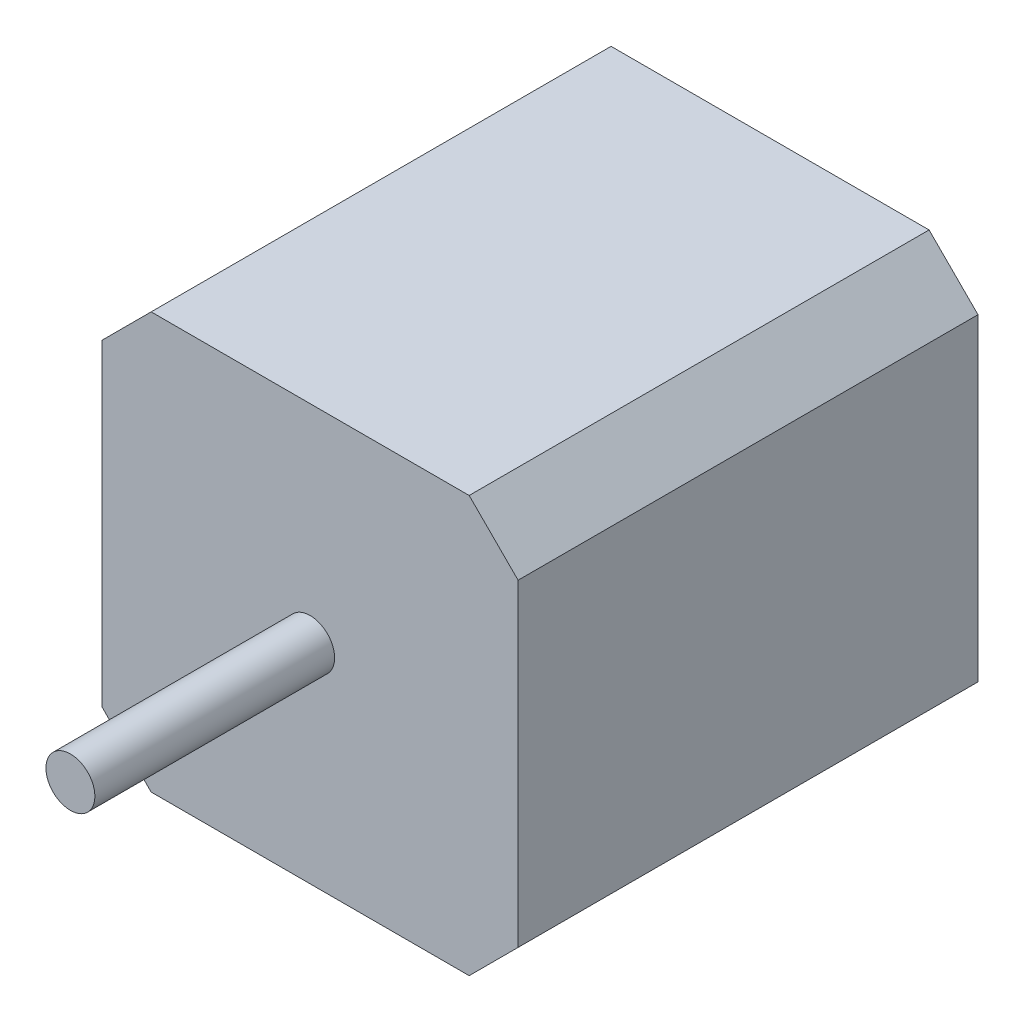
ISO-10303-21;
HEADER;
FILE_DESCRIPTION(('STEP AP214'),'2;1');
FILE_NAME('part.step','',(''),(''),'','','');
FILE_SCHEMA(('AUTOMOTIVE_DESIGN { 1 0 10303 214 1 1 1 1 }'));
ENDSEC;
DATA;
#1=APPLICATION_CONTEXT('core data for automotive mechanical design processes');
#2=APPLICATION_PROTOCOL_DEFINITION('international standard','automotive_design',2000,#1);
#3=PRODUCT_CONTEXT('',#1,'mechanical');
#4=PRODUCT('Part','Part','',(#3));
#5=PRODUCT_RELATED_PRODUCT_CATEGORY('part','',(#4));
#6=PRODUCT_DEFINITION_FORMATION('','',#4);
#7=PRODUCT_DEFINITION_CONTEXT('part definition',#1,'design');
#8=PRODUCT_DEFINITION('design','',#6,#7);
#9=PRODUCT_DEFINITION_SHAPE('','',#8);
#10=(LENGTH_UNIT() NAMED_UNIT(*) SI_UNIT(.MILLI.,.METRE.));
#11=(NAMED_UNIT(*) PLANE_ANGLE_UNIT() SI_UNIT($,.RADIAN.));
#12=(NAMED_UNIT(*) SI_UNIT($,.STERADIAN.) SOLID_ANGLE_UNIT());
#13=UNCERTAINTY_MEASURE_WITH_UNIT(LENGTH_MEASURE(1.E-05),#10,'distance_accuracy_value','');
#14=(GEOMETRIC_REPRESENTATION_CONTEXT(3) GLOBAL_UNCERTAINTY_ASSIGNED_CONTEXT((#13)) GLOBAL_UNIT_ASSIGNED_CONTEXT((#10,
#11,#12)) REPRESENTATION_CONTEXT('',''));
#15=CARTESIAN_POINT('',(0.,0.,0.));
#16=DIRECTION('',(0.,0.,1.));
#17=DIRECTION('',(1.,0.,0.));
#18=AXIS2_PLACEMENT_3D('',#15,#16,#17);
#19=CARTESIAN_POINT('',(0.,0.,47.));
#20=DIRECTION('',(0.,0.,1.));
#21=DIRECTION('',(1.,0.,0.));
#22=AXIS2_PLACEMENT_3D('',#19,#20,#21);
#23=PLANE('',#22);
#24=DIRECTION('',(1.,0.,0.));
#25=VECTOR('',#24,1.);
#26=CARTESIAN_POINT('',(-41.6448477794809,-14.902025479471,47.));
#27=LINE('',#26,#25);
#28=CARTESIAN_POINT('',(-36.6448477794809,-14.902025479471,47.));
#29=VERTEX_POINT('',#28);
#30=CARTESIAN_POINT('',(-4.14484777948092,-14.902025479471,47.));
#31=VERTEX_POINT('',#30);
#32=EDGE_CURVE('E170',#29,#31,#27,.T.);
#33=ORIENTED_EDGE('',*,*,#32,.T.);
#34=DIRECTION('',(-0.707106781186548,-0.707106781186547,0.));
#35=VECTOR('',#34,1.);
#36=CARTESIAN_POINT('',(5.37858884999505,-5.37858884999506,47.));
#37=LINE('',#36,#35);
#38=CARTESIAN_POINT('',(0.855152220519106,-9.90202547947099,47.));
#39=VERTEX_POINT('',#38);
#40=EDGE_CURVE('E148',#31,#39,#37,.F.);
#41=ORIENTED_EDGE('',*,*,#40,.T.);
#42=DIRECTION('',(0.,1.,0.));
#43=VECTOR('',#42,1.);
#44=CARTESIAN_POINT('',(0.855152220519101,27.597974520529,47.));
#45=LINE('',#44,#43);
#46=CARTESIAN_POINT('',(0.855152220519099,22.597974520529,47.));
#47=VERTEX_POINT('',#46);
#48=EDGE_CURVE('E119',#39,#47,#45,.T.);
#49=ORIENTED_EDGE('',*,*,#48,.T.);
#50=DIRECTION('',(0.707106781186547,-0.707106781186548,0.));
#51=VECTOR('',#50,1.);
#52=CARTESIAN_POINT('',(11.7265633705241,11.726563370524,47.));
#53=LINE('',#52,#51);
#54=CARTESIAN_POINT('',(-4.14484777948089,27.597974520529,47.));
#55=VERTEX_POINT('',#54);
#56=EDGE_CURVE('E55',#47,#55,#53,.F.);
#57=ORIENTED_EDGE('',*,*,#56,.T.);
#58=DIRECTION('',(-1.,0.,0.));
#59=VECTOR('',#58,1.);
#60=CARTESIAN_POINT('',(-41.6448477794809,27.597974520529,47.));
#61=LINE('',#60,#59);
#62=CARTESIAN_POINT('',(-36.6448477794809,27.597974520529,47.));
#63=VERTEX_POINT('',#62);
#64=EDGE_CURVE('E134',#55,#63,#61,.T.);
#65=ORIENTED_EDGE('',*,*,#64,.T.);
#66=DIRECTION('',(0.707106781186549,0.707106781186547,0.));
#67=VECTOR('',#66,1.);
#68=CARTESIAN_POINT('',(-32.1214111500049,32.121411150005,47.));
#69=LINE('',#68,#67);
#70=CARTESIAN_POINT('',(-41.6448477794809,22.597974520529,47.));
#71=VERTEX_POINT('',#70);
#72=EDGE_CURVE('E144',#63,#71,#69,.F.);
#73=ORIENTED_EDGE('',*,*,#72,.T.);
#74=DIRECTION('',(0.,-1.,0.));
#75=VECTOR('',#74,1.);
#76=CARTESIAN_POINT('',(-41.6448477794809,27.597974520529,47.));
#77=LINE('',#76,#75);
#78=CARTESIAN_POINT('',(-41.6448477794809,-9.90202547947095,47.));
#79=VERTEX_POINT('',#78);
#80=EDGE_CURVE('E128',#71,#79,#77,.T.);
#81=ORIENTED_EDGE('',*,*,#80,.T.);
#82=DIRECTION('',(-0.707106781186546,0.70710678118655,0.));
#83=VECTOR('',#82,1.);
#84=CARTESIAN_POINT('',(-25.773436629476,-25.7734366294759,47.));
#85=LINE('',#84,#83);
#86=EDGE_CURVE('E146',#79,#29,#85,.F.);
#87=ORIENTED_EDGE('',*,*,#86,.T.);
#88=EDGE_LOOP('',(#33,#41,#49,#57,#65,#73,#81,#87));
#89=FACE_BOUND('',#88,.T.);
#90=CARTESIAN_POINT('',(-20.3948477794809,6.347974520529,47.));
#91=DIRECTION('',(0.,0.,1.));
#92=DIRECTION('',(1.,0.,0.));
#93=AXIS2_PLACEMENT_3D('',#90,#91,#92);
#94=CIRCLE('',#93,2.5);
#95=CARTESIAN_POINT('',(-17.8948477794809,6.347974520529,47.));
#96=VERTEX_POINT('',#95);
#97=EDGE_CURVE('E175',#96,#96,#94,.T.);
#98=ORIENTED_EDGE('',*,*,#97,.F.);
#99=EDGE_LOOP('',(#98));
#100=FACE_BOUND('',#99,.T.);
#101=ADVANCED_FACE('F35',(#89,#100),#23,.T.);
#102=CARTESIAN_POINT('',(-41.6448477794809,27.597974520529,47.));
#103=DIRECTION('',(1.,0.,0.));
#104=DIRECTION('',(0.,0.,-1.));
#105=AXIS2_PLACEMENT_3D('',#102,#103,#104);
#106=PLANE('',#105);
#107=DIRECTION('',(0.,-1.,0.));
#108=VECTOR('',#107,1.);
#109=CARTESIAN_POINT('',(-41.6448477794809,27.597974520529,0.));
#110=LINE('',#109,#108);
#111=CARTESIAN_POINT('',(-41.6448477794809,22.597974520529,0.));
#112=VERTEX_POINT('',#111);
#113=CARTESIAN_POINT('',(-41.6448477794809,-9.90202547947096,0.));
#114=VERTEX_POINT('',#113);
#115=EDGE_CURVE('E130',#112,#114,#110,.T.);
#116=ORIENTED_EDGE('',*,*,#115,.T.);
#117=DIRECTION('',(0.,0.,1.));
#118=VECTOR('',#117,1.);
#119=CARTESIAN_POINT('',(-41.6448477794809,-9.90202547947096,47.));
#120=LINE('',#119,#118);
#121=EDGE_CURVE('E153',#114,#79,#120,.T.);
#122=ORIENTED_EDGE('',*,*,#121,.T.);
#123=ORIENTED_EDGE('',*,*,#80,.F.);
#124=DIRECTION('',(0.,0.,-1.));
#125=VECTOR('',#124,1.);
#126=CARTESIAN_POINT('',(-41.6448477794809,22.597974520529,47.));
#127=LINE('',#126,#125);
#128=EDGE_CURVE('E150',#71,#112,#127,.T.);
#129=ORIENTED_EDGE('',*,*,#128,.T.);
#130=EDGE_LOOP('',(#116,#122,#123,#129));
#131=FACE_BOUND('',#130,.T.);
#132=ADVANCED_FACE('F166',(#131),#106,.F.);
#133=CARTESIAN_POINT('',(-41.6448477794809,-14.902025479471,47.));
#134=DIRECTION('',(0.,1.,0.));
#135=DIRECTION('',(0.,0.,1.));
#136=AXIS2_PLACEMENT_3D('',#133,#134,#135);
#137=PLANE('',#136);
#138=DIRECTION('',(1.,0.,0.));
#139=VECTOR('',#138,1.);
#140=CARTESIAN_POINT('',(-41.6448477794809,-14.902025479471,0.));
#141=LINE('',#140,#139);
#142=CARTESIAN_POINT('',(-36.6448477794809,-14.902025479471,0.));
#143=VERTEX_POINT('',#142);
#144=CARTESIAN_POINT('',(-4.14484777948091,-14.902025479471,0.));
#145=VERTEX_POINT('',#144);
#146=EDGE_CURVE('E126',#143,#145,#141,.T.);
#147=ORIENTED_EDGE('',*,*,#146,.T.);
#148=DIRECTION('',(0.,0.,1.));
#149=VECTOR('',#148,1.);
#150=CARTESIAN_POINT('',(-4.14484777948091,-14.902025479471,47.));
#151=LINE('',#150,#149);
#152=EDGE_CURVE('E105',#145,#31,#151,.T.);
#153=ORIENTED_EDGE('',*,*,#152,.T.);
#154=ORIENTED_EDGE('',*,*,#32,.F.);
#155=DIRECTION('',(0.,0.,-1.));
#156=VECTOR('',#155,1.);
#157=CARTESIAN_POINT('',(-36.6448477794809,-14.902025479471,47.));
#158=LINE('',#157,#156);
#159=EDGE_CURVE('E110',#29,#143,#158,.T.);
#160=ORIENTED_EDGE('',*,*,#159,.T.);
#161=EDGE_LOOP('',(#147,#153,#154,#160));
#162=FACE_BOUND('',#161,.T.);
#163=ADVANCED_FACE('F193',(#162),#137,.F.);
#164=CARTESIAN_POINT('',(0.855152220519101,27.597974520529,47.));
#165=DIRECTION('',(-1.,0.,0.));
#166=DIRECTION('',(0.,-1.,0.));
#167=AXIS2_PLACEMENT_3D('',#164,#165,#166);
#168=PLANE('',#167);
#169=ORIENTED_EDGE('',*,*,#48,.F.);
#170=DIRECTION('',(0.,0.,-1.));
#171=VECTOR('',#170,1.);
#172=CARTESIAN_POINT('',(0.855152220519105,-9.90202547947099,47.));
#173=LINE('',#172,#171);
#174=CARTESIAN_POINT('',(0.855152220519107,-9.90202547947099,0.));
#175=VERTEX_POINT('',#174);
#176=EDGE_CURVE('E104',#39,#175,#173,.T.);
#177=ORIENTED_EDGE('',*,*,#176,.T.);
#178=DIRECTION('',(0.,1.,0.));
#179=VECTOR('',#178,1.);
#180=CARTESIAN_POINT('',(0.855152220519101,27.597974520529,0.));
#181=LINE('',#180,#179);
#182=CARTESIAN_POINT('',(0.855152220519102,22.597974520529,0.));
#183=VERTEX_POINT('',#182);
#184=EDGE_CURVE('E117',#175,#183,#181,.T.);
#185=ORIENTED_EDGE('',*,*,#184,.T.);
#186=DIRECTION('',(0.,0.,1.));
#187=VECTOR('',#186,1.);
#188=CARTESIAN_POINT('',(0.855152220519102,22.597974520529,47.));
#189=LINE('',#188,#187);
#190=EDGE_CURVE('E121',#183,#47,#189,.T.);
#191=ORIENTED_EDGE('',*,*,#190,.T.);
#192=EDGE_LOOP('',(#169,#177,#185,#191));
#193=FACE_BOUND('',#192,.T.);
#194=ADVANCED_FACE('F116',(#193),#168,.F.);
#195=CARTESIAN_POINT('',(-41.6448477794809,27.597974520529,47.));
#196=DIRECTION('',(0.,-1.,0.));
#197=DIRECTION('',(0.,0.,-1.));
#198=AXIS2_PLACEMENT_3D('',#195,#196,#197);
#199=PLANE('',#198);
#200=DIRECTION('',(-1.,0.,0.));
#201=VECTOR('',#200,1.);
#202=CARTESIAN_POINT('',(-41.6448477794809,27.597974520529,0.));
#203=LINE('',#202,#201);
#204=CARTESIAN_POINT('',(-4.14484777948089,27.597974520529,0.));
#205=VERTEX_POINT('',#204);
#206=CARTESIAN_POINT('',(-36.6448477794809,27.597974520529,0.));
#207=VERTEX_POINT('',#206);
#208=EDGE_CURVE('E125',#205,#207,#203,.T.);
#209=ORIENTED_EDGE('',*,*,#208,.T.);
#210=DIRECTION('',(0.,0.,1.));
#211=VECTOR('',#210,1.);
#212=CARTESIAN_POINT('',(-36.6448477794809,27.597974520529,47.));
#213=LINE('',#212,#211);
#214=EDGE_CURVE('E11',#207,#63,#213,.T.);
#215=ORIENTED_EDGE('',*,*,#214,.T.);
#216=ORIENTED_EDGE('',*,*,#64,.F.);
#217=DIRECTION('',(0.,0.,-1.));
#218=VECTOR('',#217,1.);
#219=CARTESIAN_POINT('',(-4.14484777948088,27.597974520529,47.));
#220=LINE('',#219,#218);
#221=EDGE_CURVE('E43',#55,#205,#220,.T.);
#222=ORIENTED_EDGE('',*,*,#221,.T.);
#223=EDGE_LOOP('',(#209,#215,#216,#222));
#224=FACE_BOUND('',#223,.T.);
#225=ADVANCED_FACE('F156',(#224),#199,.F.);
#226=CARTESIAN_POINT('',(0.,0.,0.));
#227=DIRECTION('',(0.,0.,1.));
#228=DIRECTION('',(1.,0.,0.));
#229=AXIS2_PLACEMENT_3D('',#226,#227,#228);
#230=PLANE('',#229);
#231=ORIENTED_EDGE('',*,*,#184,.F.);
#232=DIRECTION('',(0.707106781186548,0.707106781186547,0.));
#233=VECTOR('',#232,1.);
#234=CARTESIAN_POINT('',(0.855152220519105,-9.90202547947099,0.));
#235=LINE('',#234,#233);
#236=EDGE_CURVE('E100',#175,#145,#235,.F.);
#237=ORIENTED_EDGE('',*,*,#236,.T.);
#238=ORIENTED_EDGE('',*,*,#146,.F.);
#239=DIRECTION('',(0.707106781186546,-0.70710678118655,0.));
#240=VECTOR('',#239,1.);
#241=CARTESIAN_POINT('',(-36.6448477794809,-14.902025479471,0.));
#242=LINE('',#241,#240);
#243=EDGE_CURVE('E111',#143,#114,#242,.F.);
#244=ORIENTED_EDGE('',*,*,#243,.T.);
#245=ORIENTED_EDGE('',*,*,#115,.F.);
#246=DIRECTION('',(-0.707106781186549,-0.707106781186547,0.));
#247=VECTOR('',#246,1.);
#248=CARTESIAN_POINT('',(-41.6448477794809,22.597974520529,0.));
#249=LINE('',#248,#247);
#250=EDGE_CURVE('E137',#112,#207,#249,.F.);
#251=ORIENTED_EDGE('',*,*,#250,.T.);
#252=ORIENTED_EDGE('',*,*,#208,.F.);
#253=DIRECTION('',(-0.707106781186547,0.707106781186548,0.));
#254=VECTOR('',#253,1.);
#255=CARTESIAN_POINT('',(-4.14484777948088,27.597974520529,0.));
#256=LINE('',#255,#254);
#257=EDGE_CURVE('E120',#205,#183,#256,.F.);
#258=ORIENTED_EDGE('',*,*,#257,.T.);
#259=EDGE_LOOP('',(#231,#237,#238,#244,#245,#251,#252,#258));
#260=FACE_BOUND('',#259,.T.);
#261=ADVANCED_FACE('F123',(#260),#230,.F.);
#262=CARTESIAN_POINT('',(0.855152220519105,-9.90202547947099,47.));
#263=DIRECTION('',(-0.707106781186547,0.707106781186548,0.));
#264=DIRECTION('',(0.,0.,-1.));
#265=AXIS2_PLACEMENT_3D('',#262,#263,#264);
#266=PLANE('',#265);
#267=ORIENTED_EDGE('',*,*,#40,.F.);
#268=ORIENTED_EDGE('',*,*,#152,.F.);
#269=ORIENTED_EDGE('',*,*,#236,.F.);
#270=ORIENTED_EDGE('',*,*,#176,.F.);
#271=EDGE_LOOP('',(#267,#268,#269,#270));
#272=FACE_BOUND('',#271,.T.);
#273=ADVANCED_FACE('F103',(#272),#266,.F.);
#274=CARTESIAN_POINT('',(-36.6448477794809,-14.902025479471,47.));
#275=DIRECTION('',(0.70710678118655,0.707106781186546,0.));
#276=DIRECTION('',(0.,0.,-1.));
#277=AXIS2_PLACEMENT_3D('',#274,#275,#276);
#278=PLANE('',#277);
#279=ORIENTED_EDGE('',*,*,#86,.F.);
#280=ORIENTED_EDGE('',*,*,#121,.F.);
#281=ORIENTED_EDGE('',*,*,#243,.F.);
#282=ORIENTED_EDGE('',*,*,#159,.F.);
#283=EDGE_LOOP('',(#279,#280,#281,#282));
#284=FACE_BOUND('',#283,.T.);
#285=ADVANCED_FACE('F209',(#284),#278,.F.);
#286=CARTESIAN_POINT('',(-41.6448477794809,22.597974520529,47.));
#287=DIRECTION('',(0.707106781186546,-0.707106781186548,0.));
#288=DIRECTION('',(0.,0.,-1.));
#289=AXIS2_PLACEMENT_3D('',#286,#287,#288);
#290=PLANE('',#289);
#291=ORIENTED_EDGE('',*,*,#72,.F.);
#292=ORIENTED_EDGE('',*,*,#214,.F.);
#293=ORIENTED_EDGE('',*,*,#250,.F.);
#294=ORIENTED_EDGE('',*,*,#128,.F.);
#295=EDGE_LOOP('',(#291,#292,#293,#294));
#296=FACE_BOUND('',#295,.T.);
#297=ADVANCED_FACE('F163',(#296),#290,.F.);
#298=CARTESIAN_POINT('',(-4.14484777948088,27.597974520529,47.));
#299=DIRECTION('',(-0.707106781186548,-0.707106781186547,0.));
#300=DIRECTION('',(0.,0.,-1.));
#301=AXIS2_PLACEMENT_3D('',#298,#299,#300);
#302=PLANE('',#301);
#303=ORIENTED_EDGE('',*,*,#56,.F.);
#304=ORIENTED_EDGE('',*,*,#190,.F.);
#305=ORIENTED_EDGE('',*,*,#257,.F.);
#306=ORIENTED_EDGE('',*,*,#221,.F.);
#307=EDGE_LOOP('',(#303,#304,#305,#306));
#308=FACE_BOUND('',#307,.T.);
#309=ADVANCED_FACE('F37',(#308),#302,.F.);
#310=CARTESIAN_POINT('',(-20.3948477794809,6.347974520529,71.5));
#311=DIRECTION('',(0.,0.,-1.));
#312=DIRECTION('',(-1.,0.,0.));
#313=AXIS2_PLACEMENT_3D('',#310,#311,#312);
#314=CYLINDRICAL_SURFACE('',#313,2.5);
#315=CARTESIAN_POINT('',(-20.3948477794809,6.347974520529,71.5));
#316=DIRECTION('',(0.,0.,1.));
#317=DIRECTION('',(1.,0.,0.));
#318=AXIS2_PLACEMENT_3D('',#315,#316,#317);
#319=CIRCLE('',#318,2.5);
#320=CARTESIAN_POINT('',(-17.8948477794809,6.347974520529,71.5));
#321=VERTEX_POINT('',#320);
#322=EDGE_CURVE('E179',#321,#321,#319,.T.);
#323=ORIENTED_EDGE('',*,*,#322,.F.);
#324=EDGE_LOOP('',(#323));
#325=FACE_BOUND('',#324,.T.);
#326=ORIENTED_EDGE('',*,*,#97,.T.);
#327=EDGE_LOOP('',(#326));
#328=FACE_BOUND('',#327,.T.);
#329=ADVANCED_FACE('F186',(#325,#328),#314,.T.);
#330=CARTESIAN_POINT('',(-20.3948477794809,6.347974520529,71.5));
#331=DIRECTION('',(0.,0.,1.));
#332=DIRECTION('',(1.,0.,0.));
#333=AXIS2_PLACEMENT_3D('',#330,#331,#332);
#334=PLANE('',#333);
#335=ORIENTED_EDGE('',*,*,#322,.T.);
#336=EDGE_LOOP('',(#335));
#337=FACE_BOUND('',#336,.T.);
#338=ADVANCED_FACE('F219',(#337),#334,.T.);
#339=CLOSED_SHELL('',(#101,#132,#163,#194,#225,#261,#273,#285,#297,#309,#329,#338));
#340=MANIFOLD_SOLID_BREP('B2',#339);
#341=ADVANCED_BREP_SHAPE_REPRESENTATION('',(#18,#340),#14);
#342=SHAPE_DEFINITION_REPRESENTATION(#9,#341);
ENDSEC;
END-ISO-10303-21;
